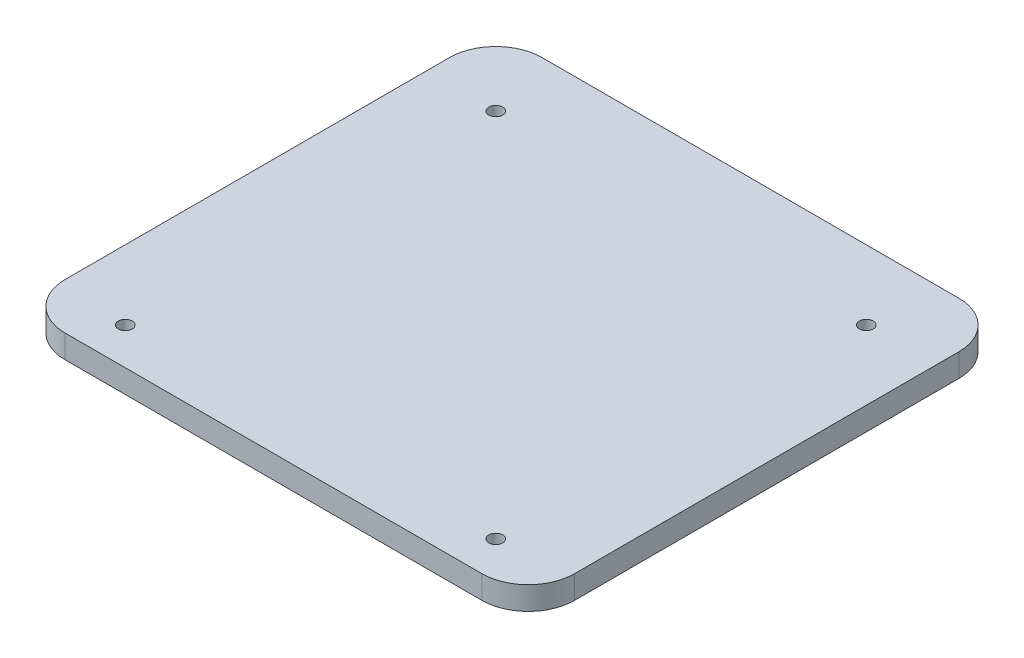
ISO-10303-21;
HEADER;
FILE_DESCRIPTION(('STEP AP214'),'2;1');
FILE_NAME('part.step','',(''),(''),'','','');
FILE_SCHEMA(('AUTOMOTIVE_DESIGN { 1 0 10303 214 1 1 1 1 }'));
ENDSEC;
DATA;
#1=APPLICATION_CONTEXT('core data for automotive mechanical design processes');
#2=APPLICATION_PROTOCOL_DEFINITION('international standard','automotive_design',2000,#1);
#3=PRODUCT_CONTEXT('',#1,'mechanical');
#4=PRODUCT('Part','Part','',(#3));
#5=PRODUCT_RELATED_PRODUCT_CATEGORY('part','',(#4));
#6=PRODUCT_DEFINITION_FORMATION('','',#4);
#7=PRODUCT_DEFINITION_CONTEXT('part definition',#1,'design');
#8=PRODUCT_DEFINITION('design','',#6,#7);
#9=PRODUCT_DEFINITION_SHAPE('','',#8);
#10=(LENGTH_UNIT() NAMED_UNIT(*) SI_UNIT(.MILLI.,.METRE.));
#11=(NAMED_UNIT(*) PLANE_ANGLE_UNIT() SI_UNIT($,.RADIAN.));
#12=(NAMED_UNIT(*) SI_UNIT($,.STERADIAN.) SOLID_ANGLE_UNIT());
#13=UNCERTAINTY_MEASURE_WITH_UNIT(LENGTH_MEASURE(1.E-05),#10,'distance_accuracy_value','');
#14=(GEOMETRIC_REPRESENTATION_CONTEXT(3) GLOBAL_UNCERTAINTY_ASSIGNED_CONTEXT((#13)) GLOBAL_UNIT_ASSIGNED_CONTEXT((#10,
#11,#12)) REPRESENTATION_CONTEXT('',''));
#15=CARTESIAN_POINT('',(0.,0.,0.));
#16=DIRECTION('',(0.,0.,1.));
#17=DIRECTION('',(1.,0.,0.));
#18=AXIS2_PLACEMENT_3D('',#15,#16,#17);
#19=CARTESIAN_POINT('',(0.,5.,0.));
#20=DIRECTION('',(0.,1.,0.));
#21=DIRECTION('',(0.,0.,1.));
#22=AXIS2_PLACEMENT_3D('',#19,#20,#21);
#23=PLANE('',#22);
#24=CARTESIAN_POINT('',(40.,5.,43.5));
#25=DIRECTION('',(0.,1.,0.));
#26=DIRECTION('',(0.,0.,1.));
#27=AXIS2_PLACEMENT_3D('',#24,#25,#26);
#28=CIRCLE('',#27,1.5);
#29=CARTESIAN_POINT('',(40.,5.,45.));
#30=VERTEX_POINT('',#29);
#31=EDGE_CURVE('E191',#30,#30,#28,.T.);
#32=ORIENTED_EDGE('',*,*,#31,.F.);
#33=EDGE_LOOP('',(#32));
#34=FACE_BOUND('',#33,.T.);
#35=CARTESIAN_POINT('',(-40.,5.,43.5));
#36=DIRECTION('',(0.,1.,0.));
#37=DIRECTION('',(0.,0.,1.));
#38=AXIS2_PLACEMENT_3D('',#35,#36,#37);
#39=CIRCLE('',#38,1.5);
#40=CARTESIAN_POINT('',(-40.,5.,45.));
#41=VERTEX_POINT('',#40);
#42=EDGE_CURVE('E181',#41,#41,#39,.T.);
#43=ORIENTED_EDGE('',*,*,#42,.F.);
#44=EDGE_LOOP('',(#43));
#45=FACE_BOUND('',#44,.T.);
#46=DIRECTION('',(-1.,0.,0.));
#47=VECTOR('',#46,1.);
#48=CARTESIAN_POINT('',(-55.,5.,-51.5));
#49=LINE('',#48,#47);
#50=CARTESIAN_POINT('',(45.,5.,-51.5));
#51=VERTEX_POINT('',#50);
#52=CARTESIAN_POINT('',(-45.,5.,-51.5));
#53=VERTEX_POINT('',#52);
#54=EDGE_CURVE('E172',#51,#53,#49,.T.);
#55=ORIENTED_EDGE('',*,*,#54,.T.);
#56=CARTESIAN_POINT('',(-45.,5.,-41.5));
#57=DIRECTION('',(0.,1.,0.));
#58=DIRECTION('',(0.,0.,1.));
#59=AXIS2_PLACEMENT_3D('',#56,#57,#58);
#60=CIRCLE('',#59,10.);
#61=CARTESIAN_POINT('',(-55.,5.,-41.5));
#62=VERTEX_POINT('',#61);
#63=EDGE_CURVE('E150',#53,#62,#60,.T.);
#64=ORIENTED_EDGE('',*,*,#63,.T.);
#65=DIRECTION('',(0.,0.,1.));
#66=VECTOR('',#65,1.);
#67=CARTESIAN_POINT('',(-55.,5.,-51.5));
#68=LINE('',#67,#66);
#69=CARTESIAN_POINT('',(-55.,5.,41.5));
#70=VERTEX_POINT('',#69);
#71=EDGE_CURVE('E120',#62,#70,#68,.T.);
#72=ORIENTED_EDGE('',*,*,#71,.T.);
#73=CARTESIAN_POINT('',(-45.,5.,41.5));
#74=DIRECTION('',(0.,1.,0.));
#75=DIRECTION('',(0.,0.,1.));
#76=AXIS2_PLACEMENT_3D('',#73,#74,#75);
#77=CIRCLE('',#76,10.);
#78=CARTESIAN_POINT('',(-45.,5.,51.5));
#79=VERTEX_POINT('',#78);
#80=EDGE_CURVE('E56',#70,#79,#77,.T.);
#81=ORIENTED_EDGE('',*,*,#80,.T.);
#82=DIRECTION('',(1.,0.,0.));
#83=VECTOR('',#82,1.);
#84=CARTESIAN_POINT('',(-55.,5.,51.5));
#85=LINE('',#84,#83);
#86=CARTESIAN_POINT('',(45.,5.,51.5));
#87=VERTEX_POINT('',#86);
#88=EDGE_CURVE('E136',#79,#87,#85,.T.);
#89=ORIENTED_EDGE('',*,*,#88,.T.);
#90=CARTESIAN_POINT('',(45.,5.,41.5));
#91=DIRECTION('',(0.,1.,0.));
#92=DIRECTION('',(0.,0.,1.));
#93=AXIS2_PLACEMENT_3D('',#90,#91,#92);
#94=CIRCLE('',#93,10.);
#95=CARTESIAN_POINT('',(55.,5.,41.5));
#96=VERTEX_POINT('',#95);
#97=EDGE_CURVE('E146',#87,#96,#94,.T.);
#98=ORIENTED_EDGE('',*,*,#97,.T.);
#99=DIRECTION('',(0.,0.,-1.));
#100=VECTOR('',#99,1.);
#101=CARTESIAN_POINT('',(55.,5.,-51.5));
#102=LINE('',#101,#100);
#103=CARTESIAN_POINT('',(55.,5.,-41.5));
#104=VERTEX_POINT('',#103);
#105=EDGE_CURVE('E130',#96,#104,#102,.T.);
#106=ORIENTED_EDGE('',*,*,#105,.T.);
#107=CARTESIAN_POINT('',(45.,5.,-41.5));
#108=DIRECTION('',(0.,1.,0.));
#109=DIRECTION('',(0.,0.,1.));
#110=AXIS2_PLACEMENT_3D('',#107,#108,#109);
#111=CIRCLE('',#110,10.);
#112=EDGE_CURVE('E148',#104,#51,#111,.T.);
#113=ORIENTED_EDGE('',*,*,#112,.T.);
#114=EDGE_LOOP('',(#55,#64,#72,#81,#89,#98,#106,#113));
#115=FACE_BOUND('',#114,.T.);
#116=CARTESIAN_POINT('',(-40.,5.,-36.5));
#117=DIRECTION('',(0.,1.,0.));
#118=DIRECTION('',(0.,0.,1.));
#119=AXIS2_PLACEMENT_3D('',#116,#117,#118);
#120=CIRCLE('',#119,1.5);
#121=CARTESIAN_POINT('',(-40.,5.,-35.));
#122=VERTEX_POINT('',#121);
#123=EDGE_CURVE('E186',#122,#122,#120,.T.);
#124=ORIENTED_EDGE('',*,*,#123,.F.);
#125=EDGE_LOOP('',(#124));
#126=FACE_BOUND('',#125,.T.);
#127=CARTESIAN_POINT('',(40.,5.,-36.5));
#128=DIRECTION('',(0.,1.,0.));
#129=DIRECTION('',(0.,0.,1.));
#130=AXIS2_PLACEMENT_3D('',#127,#128,#129);
#131=CIRCLE('',#130,1.5);
#132=CARTESIAN_POINT('',(40.,5.,-35.));
#133=VERTEX_POINT('',#132);
#134=EDGE_CURVE('E197',#133,#133,#131,.T.);
#135=ORIENTED_EDGE('',*,*,#134,.F.);
#136=EDGE_LOOP('',(#135));
#137=FACE_BOUND('',#136,.T.);
#138=ADVANCED_FACE('F36',(#34,#45,#115,#126,#137),#23,.T.);
#139=CARTESIAN_POINT('',(0.,0.,0.));
#140=DIRECTION('',(0.,1.,0.));
#141=DIRECTION('',(0.,0.,1.));
#142=AXIS2_PLACEMENT_3D('',#139,#140,#141);
#143=PLANE('',#142);
#144=DIRECTION('',(0.,0.,1.));
#145=VECTOR('',#144,1.);
#146=CARTESIAN_POINT('',(-55.,0.,-51.5));
#147=LINE('',#146,#145);
#148=CARTESIAN_POINT('',(-55.,0.,-41.5));
#149=VERTEX_POINT('',#148);
#150=CARTESIAN_POINT('',(-55.,0.,41.5));
#151=VERTEX_POINT('',#150);
#152=EDGE_CURVE('E118',#149,#151,#147,.T.);
#153=ORIENTED_EDGE('',*,*,#152,.F.);
#154=CARTESIAN_POINT('',(-45.,0.,-41.5));
#155=DIRECTION('',(0.,1.,0.));
#156=DIRECTION('',(0.,0.,1.));
#157=AXIS2_PLACEMENT_3D('',#154,#155,#156);
#158=CIRCLE('',#157,10.);
#159=CARTESIAN_POINT('',(-45.,0.,-51.5));
#160=VERTEX_POINT('',#159);
#161=EDGE_CURVE('E101',#149,#160,#158,.F.);
#162=ORIENTED_EDGE('',*,*,#161,.T.);
#163=DIRECTION('',(-1.,0.,0.));
#164=VECTOR('',#163,1.);
#165=CARTESIAN_POINT('',(-55.,0.,-51.5));
#166=LINE('',#165,#164);
#167=CARTESIAN_POINT('',(45.,0.,-51.5));
#168=VERTEX_POINT('',#167);
#169=EDGE_CURVE('E128',#168,#160,#166,.T.);
#170=ORIENTED_EDGE('',*,*,#169,.F.);
#171=CARTESIAN_POINT('',(45.,0.,-41.5));
#172=DIRECTION('',(0.,1.,0.));
#173=DIRECTION('',(0.,0.,1.));
#174=AXIS2_PLACEMENT_3D('',#171,#172,#173);
#175=CIRCLE('',#174,10.);
#176=CARTESIAN_POINT('',(55.,0.,-41.5));
#177=VERTEX_POINT('',#176);
#178=EDGE_CURVE('E112',#168,#177,#175,.F.);
#179=ORIENTED_EDGE('',*,*,#178,.T.);
#180=DIRECTION('',(0.,0.,-1.));
#181=VECTOR('',#180,1.);
#182=CARTESIAN_POINT('',(55.,0.,-51.5));
#183=LINE('',#182,#181);
#184=CARTESIAN_POINT('',(55.,0.,41.5));
#185=VERTEX_POINT('',#184);
#186=EDGE_CURVE('E132',#185,#177,#183,.T.);
#187=ORIENTED_EDGE('',*,*,#186,.F.);
#188=CARTESIAN_POINT('',(45.,0.,41.5));
#189=DIRECTION('',(0.,1.,0.));
#190=DIRECTION('',(0.,0.,1.));
#191=AXIS2_PLACEMENT_3D('',#188,#189,#190);
#192=CIRCLE('',#191,10.);
#193=CARTESIAN_POINT('',(45.,0.,51.5));
#194=VERTEX_POINT('',#193);
#195=EDGE_CURVE('E139',#185,#194,#192,.F.);
#196=ORIENTED_EDGE('',*,*,#195,.T.);
#197=DIRECTION('',(1.,0.,0.));
#198=VECTOR('',#197,1.);
#199=CARTESIAN_POINT('',(-55.,0.,51.5));
#200=LINE('',#199,#198);
#201=CARTESIAN_POINT('',(-45.,0.,51.5));
#202=VERTEX_POINT('',#201);
#203=EDGE_CURVE('E127',#202,#194,#200,.T.);
#204=ORIENTED_EDGE('',*,*,#203,.F.);
#205=CARTESIAN_POINT('',(-45.,0.,41.5));
#206=DIRECTION('',(0.,1.,0.));
#207=DIRECTION('',(0.,0.,1.));
#208=AXIS2_PLACEMENT_3D('',#205,#206,#207);
#209=CIRCLE('',#208,10.);
#210=EDGE_CURVE('E121',#202,#151,#209,.F.);
#211=ORIENTED_EDGE('',*,*,#210,.T.);
#212=EDGE_LOOP('',(#153,#162,#170,#179,#187,#196,#204,#211));
#213=FACE_BOUND('',#212,.T.);
#214=CARTESIAN_POINT('',(-40.,0.,43.5));
#215=DIRECTION('',(0.,1.,0.));
#216=DIRECTION('',(0.,0.,1.));
#217=AXIS2_PLACEMENT_3D('',#214,#215,#216);
#218=CIRCLE('',#217,1.5);
#219=CARTESIAN_POINT('',(-40.,0.,45.));
#220=VERTEX_POINT('',#219);
#221=EDGE_CURVE('E177',#220,#220,#218,.T.);
#222=ORIENTED_EDGE('',*,*,#221,.T.);
#223=EDGE_LOOP('',(#222));
#224=FACE_BOUND('',#223,.T.);
#225=CARTESIAN_POINT('',(-40.,0.,-36.5));
#226=DIRECTION('',(0.,1.,0.));
#227=DIRECTION('',(0.,0.,1.));
#228=AXIS2_PLACEMENT_3D('',#225,#226,#227);
#229=CIRCLE('',#228,1.5);
#230=CARTESIAN_POINT('',(-40.,0.,-35.));
#231=VERTEX_POINT('',#230);
#232=EDGE_CURVE('E188',#231,#231,#229,.T.);
#233=ORIENTED_EDGE('',*,*,#232,.T.);
#234=EDGE_LOOP('',(#233));
#235=FACE_BOUND('',#234,.T.);
#236=CARTESIAN_POINT('',(40.,0.,43.5));
#237=DIRECTION('',(0.,1.,0.));
#238=DIRECTION('',(0.,0.,1.));
#239=AXIS2_PLACEMENT_3D('',#236,#237,#238);
#240=CIRCLE('',#239,1.5);
#241=CARTESIAN_POINT('',(40.,0.,45.));
#242=VERTEX_POINT('',#241);
#243=EDGE_CURVE('E194',#242,#242,#240,.T.);
#244=ORIENTED_EDGE('',*,*,#243,.T.);
#245=EDGE_LOOP('',(#244));
#246=FACE_BOUND('',#245,.T.);
#247=CARTESIAN_POINT('',(40.,0.,-36.5));
#248=DIRECTION('',(0.,1.,0.));
#249=DIRECTION('',(0.,0.,1.));
#250=AXIS2_PLACEMENT_3D('',#247,#248,#249);
#251=CIRCLE('',#250,1.5);
#252=CARTESIAN_POINT('',(40.,0.,-35.));
#253=VERTEX_POINT('',#252);
#254=EDGE_CURVE('E200',#253,#253,#251,.T.);
#255=ORIENTED_EDGE('',*,*,#254,.T.);
#256=EDGE_LOOP('',(#255));
#257=FACE_BOUND('',#256,.T.);
#258=ADVANCED_FACE('F124',(#213,#224,#235,#246,#257),#143,.F.);
#259=CARTESIAN_POINT('',(55.,5.,-51.5));
#260=DIRECTION('',(-1.,0.,0.));
#261=DIRECTION('',(0.,0.,1.));
#262=AXIS2_PLACEMENT_3D('',#259,#260,#261);
#263=PLANE('',#262);
#264=ORIENTED_EDGE('',*,*,#186,.T.);
#265=DIRECTION('',(0.,-1.,0.));
#266=VECTOR('',#265,1.);
#267=CARTESIAN_POINT('',(55.,5.,-41.5));
#268=LINE('',#267,#266);
#269=EDGE_CURVE('E155',#177,#104,#268,.F.);
#270=ORIENTED_EDGE('',*,*,#269,.T.);
#271=ORIENTED_EDGE('',*,*,#105,.F.);
#272=DIRECTION('',(0.,-1.,0.));
#273=VECTOR('',#272,1.);
#274=CARTESIAN_POINT('',(55.,5.,41.5));
#275=LINE('',#274,#273);
#276=EDGE_CURVE('E152',#96,#185,#275,.T.);
#277=ORIENTED_EDGE('',*,*,#276,.T.);
#278=EDGE_LOOP('',(#264,#270,#271,#277));
#279=FACE_BOUND('',#278,.T.);
#280=ADVANCED_FACE('F168',(#279),#263,.F.);
#281=CARTESIAN_POINT('',(-55.,5.,-51.5));
#282=DIRECTION('',(0.,0.,1.));
#283=DIRECTION('',(1.,0.,0.));
#284=AXIS2_PLACEMENT_3D('',#281,#282,#283);
#285=PLANE('',#284);
#286=ORIENTED_EDGE('',*,*,#169,.T.);
#287=DIRECTION('',(0.,-1.,0.));
#288=VECTOR('',#287,1.);
#289=CARTESIAN_POINT('',(-45.,5.,-51.5));
#290=LINE('',#289,#288);
#291=EDGE_CURVE('E106',#160,#53,#290,.F.);
#292=ORIENTED_EDGE('',*,*,#291,.T.);
#293=ORIENTED_EDGE('',*,*,#54,.F.);
#294=DIRECTION('',(0.,-1.,0.));
#295=VECTOR('',#294,1.);
#296=CARTESIAN_POINT('',(45.,5.,-51.5));
#297=LINE('',#296,#295);
#298=EDGE_CURVE('E111',#51,#168,#297,.T.);
#299=ORIENTED_EDGE('',*,*,#298,.T.);
#300=EDGE_LOOP('',(#286,#292,#293,#299));
#301=FACE_BOUND('',#300,.T.);
#302=ADVANCED_FACE('F226',(#301),#285,.F.);
#303=CARTESIAN_POINT('',(-55.,5.,-51.5));
#304=DIRECTION('',(1.,0.,0.));
#305=DIRECTION('',(0.,0.,-1.));
#306=AXIS2_PLACEMENT_3D('',#303,#304,#305);
#307=PLANE('',#306);
#308=ORIENTED_EDGE('',*,*,#71,.F.);
#309=DIRECTION('',(0.,-1.,0.));
#310=VECTOR('',#309,1.);
#311=CARTESIAN_POINT('',(-55.,5.,-41.5));
#312=LINE('',#311,#310);
#313=EDGE_CURVE('E105',#62,#149,#312,.T.);
#314=ORIENTED_EDGE('',*,*,#313,.T.);
#315=ORIENTED_EDGE('',*,*,#152,.T.);
#316=DIRECTION('',(0.,-1.,0.));
#317=VECTOR('',#316,1.);
#318=CARTESIAN_POINT('',(-55.,5.,41.5));
#319=LINE('',#318,#317);
#320=EDGE_CURVE('E122',#151,#70,#319,.F.);
#321=ORIENTED_EDGE('',*,*,#320,.T.);
#322=EDGE_LOOP('',(#308,#314,#315,#321));
#323=FACE_BOUND('',#322,.T.);
#324=ADVANCED_FACE('F117',(#323),#307,.F.);
#325=CARTESIAN_POINT('',(-55.,5.,51.5));
#326=DIRECTION('',(0.,0.,-1.));
#327=DIRECTION('',(-1.,0.,0.));
#328=AXIS2_PLACEMENT_3D('',#325,#326,#327);
#329=PLANE('',#328);
#330=ORIENTED_EDGE('',*,*,#203,.T.);
#331=DIRECTION('',(0.,-1.,0.));
#332=VECTOR('',#331,1.);
#333=CARTESIAN_POINT('',(45.,5.,51.5));
#334=LINE('',#333,#332);
#335=EDGE_CURVE('E11',#194,#87,#334,.F.);
#336=ORIENTED_EDGE('',*,*,#335,.T.);
#337=ORIENTED_EDGE('',*,*,#88,.F.);
#338=DIRECTION('',(0.,-1.,0.));
#339=VECTOR('',#338,1.);
#340=CARTESIAN_POINT('',(-45.,5.,51.5));
#341=LINE('',#340,#339);
#342=EDGE_CURVE('E44',#79,#202,#341,.T.);
#343=ORIENTED_EDGE('',*,*,#342,.T.);
#344=EDGE_LOOP('',(#330,#336,#337,#343));
#345=FACE_BOUND('',#344,.T.);
#346=ADVANCED_FACE('F158',(#345),#329,.F.);
#347=CARTESIAN_POINT('',(-40.,5.,43.5));
#348=DIRECTION('',(0.,-1.,0.));
#349=DIRECTION('',(0.,0.,-1.));
#350=AXIS2_PLACEMENT_3D('',#347,#348,#349);
#351=CYLINDRICAL_SURFACE('',#350,1.5);
#352=ORIENTED_EDGE('',*,*,#42,.T.);
#353=EDGE_LOOP('',(#352));
#354=FACE_BOUND('',#353,.T.);
#355=ORIENTED_EDGE('',*,*,#221,.F.);
#356=EDGE_LOOP('',(#355));
#357=FACE_BOUND('',#356,.T.);
#358=ADVANCED_FACE('F219',(#354,#357),#351,.F.);
#359=CARTESIAN_POINT('',(-40.,5.,-36.5));
#360=DIRECTION('',(0.,-1.,0.));
#361=DIRECTION('',(0.,0.,-1.));
#362=AXIS2_PLACEMENT_3D('',#359,#360,#361);
#363=CYLINDRICAL_SURFACE('',#362,1.5);
#364=ORIENTED_EDGE('',*,*,#123,.T.);
#365=EDGE_LOOP('',(#364));
#366=FACE_BOUND('',#365,.T.);
#367=ORIENTED_EDGE('',*,*,#232,.F.);
#368=EDGE_LOOP('',(#367));
#369=FACE_BOUND('',#368,.T.);
#370=ADVANCED_FACE('F248',(#366,#369),#363,.F.);
#371=CARTESIAN_POINT('',(40.,5.,43.5));
#372=DIRECTION('',(0.,-1.,0.));
#373=DIRECTION('',(0.,0.,-1.));
#374=AXIS2_PLACEMENT_3D('',#371,#372,#373);
#375=CYLINDRICAL_SURFACE('',#374,1.5);
#376=ORIENTED_EDGE('',*,*,#31,.T.);
#377=EDGE_LOOP('',(#376));
#378=FACE_BOUND('',#377,.T.);
#379=ORIENTED_EDGE('',*,*,#243,.F.);
#380=EDGE_LOOP('',(#379));
#381=FACE_BOUND('',#380,.T.);
#382=ADVANCED_FACE('F251',(#378,#381),#375,.F.);
#383=CARTESIAN_POINT('',(40.,5.,-36.5));
#384=DIRECTION('',(0.,-1.,0.));
#385=DIRECTION('',(0.,0.,-1.));
#386=AXIS2_PLACEMENT_3D('',#383,#384,#385);
#387=CYLINDRICAL_SURFACE('',#386,1.5);
#388=ORIENTED_EDGE('',*,*,#134,.T.);
#389=EDGE_LOOP('',(#388));
#390=FACE_BOUND('',#389,.T.);
#391=ORIENTED_EDGE('',*,*,#254,.F.);
#392=EDGE_LOOP('',(#391));
#393=FACE_BOUND('',#392,.T.);
#394=ADVANCED_FACE('F206',(#390,#393),#387,.F.);
#395=CARTESIAN_POINT('',(-45.,5.,-41.5));
#396=DIRECTION('',(0.,-1.,0.));
#397=DIRECTION('',(0.,0.,-1.));
#398=AXIS2_PLACEMENT_3D('',#395,#396,#397);
#399=CYLINDRICAL_SURFACE('',#398,10.);
#400=ORIENTED_EDGE('',*,*,#63,.F.);
#401=ORIENTED_EDGE('',*,*,#291,.F.);
#402=ORIENTED_EDGE('',*,*,#161,.F.);
#403=ORIENTED_EDGE('',*,*,#313,.F.);
#404=EDGE_LOOP('',(#400,#401,#402,#403));
#405=FACE_BOUND('',#404,.T.);
#406=ADVANCED_FACE('F104',(#405),#399,.T.);
#407=CARTESIAN_POINT('',(45.,5.,-41.5));
#408=DIRECTION('',(0.,-1.,0.));
#409=DIRECTION('',(0.,0.,-1.));
#410=AXIS2_PLACEMENT_3D('',#407,#408,#409);
#411=CYLINDRICAL_SURFACE('',#410,10.);
#412=ORIENTED_EDGE('',*,*,#112,.F.);
#413=ORIENTED_EDGE('',*,*,#269,.F.);
#414=ORIENTED_EDGE('',*,*,#178,.F.);
#415=ORIENTED_EDGE('',*,*,#298,.F.);
#416=EDGE_LOOP('',(#412,#413,#414,#415));
#417=FACE_BOUND('',#416,.T.);
#418=ADVANCED_FACE('F234',(#417),#411,.T.);
#419=CARTESIAN_POINT('',(45.,5.,41.5));
#420=DIRECTION('',(0.,-1.,0.));
#421=DIRECTION('',(0.,0.,-1.));
#422=AXIS2_PLACEMENT_3D('',#419,#420,#421);
#423=CYLINDRICAL_SURFACE('',#422,10.);
#424=ORIENTED_EDGE('',*,*,#97,.F.);
#425=ORIENTED_EDGE('',*,*,#335,.F.);
#426=ORIENTED_EDGE('',*,*,#195,.F.);
#427=ORIENTED_EDGE('',*,*,#276,.F.);
#428=EDGE_LOOP('',(#424,#425,#426,#427));
#429=FACE_BOUND('',#428,.T.);
#430=ADVANCED_FACE('F165',(#429),#423,.T.);
#431=CARTESIAN_POINT('',(-45.,5.,41.5));
#432=DIRECTION('',(0.,-1.,0.));
#433=DIRECTION('',(0.,0.,-1.));
#434=AXIS2_PLACEMENT_3D('',#431,#432,#433);
#435=CYLINDRICAL_SURFACE('',#434,10.);
#436=ORIENTED_EDGE('',*,*,#80,.F.);
#437=ORIENTED_EDGE('',*,*,#320,.F.);
#438=ORIENTED_EDGE('',*,*,#210,.F.);
#439=ORIENTED_EDGE('',*,*,#342,.F.);
#440=EDGE_LOOP('',(#436,#437,#438,#439));
#441=FACE_BOUND('',#440,.T.);
#442=ADVANCED_FACE('F38',(#441),#435,.T.);
#443=CLOSED_SHELL('',(#138,#258,#280,#302,#324,#346,#358,#370,#382,#394,#406,#418,#430,#442));
#444=MANIFOLD_SOLID_BREP('B2',#443);
#445=ADVANCED_BREP_SHAPE_REPRESENTATION('',(#18,#444),#14);
#446=SHAPE_DEFINITION_REPRESENTATION(#9,#445);
ENDSEC;
END-ISO-10303-21;
